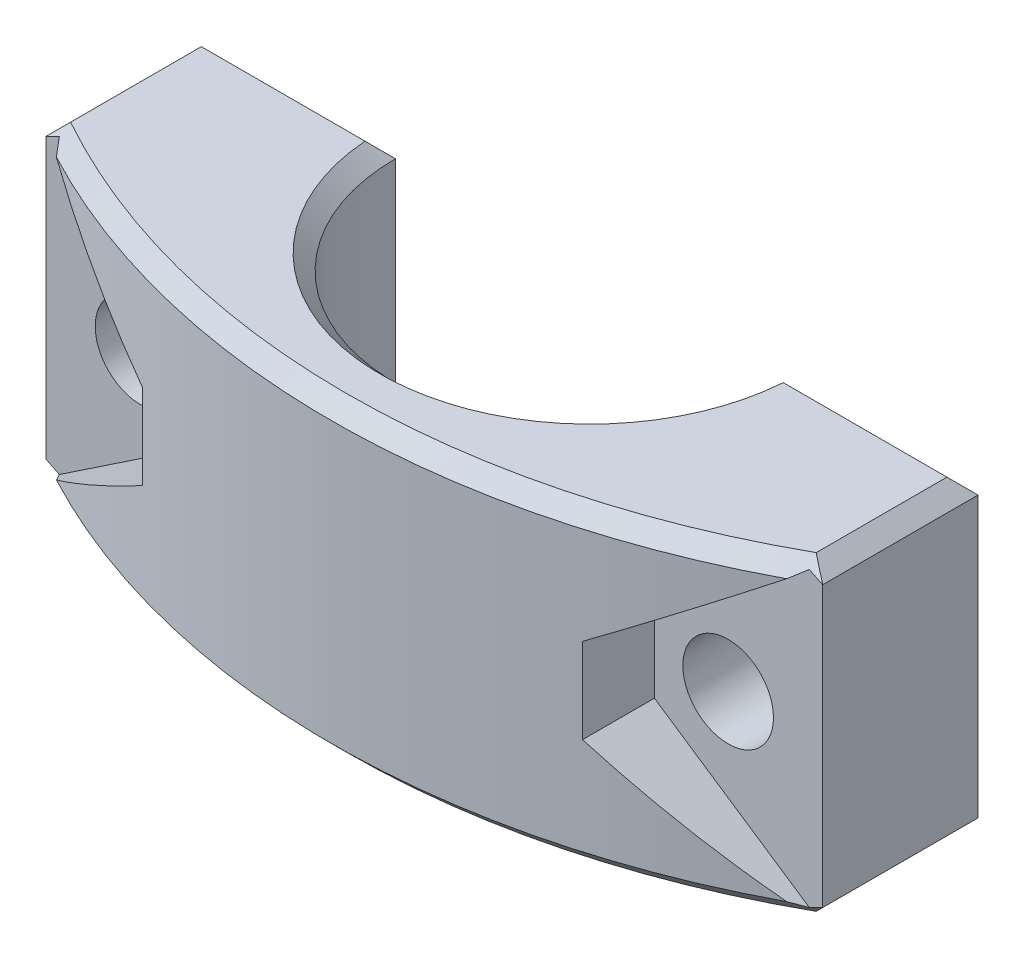
ISO-10303-21;
HEADER;
FILE_DESCRIPTION(('STEP AP214'),'2;1');
FILE_NAME('part.step','',(''),(''),'','','');
FILE_SCHEMA(('AUTOMOTIVE_DESIGN { 1 0 10303 214 1 1 1 1 }'));
ENDSEC;
DATA;
#1=APPLICATION_CONTEXT('core data for automotive mechanical design processes');
#2=APPLICATION_PROTOCOL_DEFINITION('international standard','automotive_design',2000,#1);
#3=PRODUCT_CONTEXT('',#1,'mechanical');
#4=PRODUCT('Part','Part','',(#3));
#5=PRODUCT_RELATED_PRODUCT_CATEGORY('part','',(#4));
#6=PRODUCT_DEFINITION_FORMATION('','',#4);
#7=PRODUCT_DEFINITION_CONTEXT('part definition',#1,'design');
#8=PRODUCT_DEFINITION('design','',#6,#7);
#9=PRODUCT_DEFINITION_SHAPE('','',#8);
#10=(LENGTH_UNIT() NAMED_UNIT(*) SI_UNIT(.MILLI.,.METRE.));
#11=(NAMED_UNIT(*) PLANE_ANGLE_UNIT() SI_UNIT($,.RADIAN.));
#12=(NAMED_UNIT(*) SI_UNIT($,.STERADIAN.) SOLID_ANGLE_UNIT());
#13=UNCERTAINTY_MEASURE_WITH_UNIT(LENGTH_MEASURE(1.E-05),#10,'distance_accuracy_value','');
#14=(GEOMETRIC_REPRESENTATION_CONTEXT(3) GLOBAL_UNCERTAINTY_ASSIGNED_CONTEXT((#13)) GLOBAL_UNIT_ASSIGNED_CONTEXT((#10,
#11,#12)) REPRESENTATION_CONTEXT('',''));
#15=CARTESIAN_POINT('',(0.,0.,0.));
#16=DIRECTION('',(0.,0.,1.));
#17=DIRECTION('',(1.,0.,0.));
#18=AXIS2_PLACEMENT_3D('',#15,#16,#17);
#19=CARTESIAN_POINT('',(-15.,6.,5.));
#20=DIRECTION('',(0.,-1.,0.));
#21=DIRECTION('',(0.,0.,-1.));
#22=AXIS2_PLACEMENT_3D('',#19,#20,#21);
#23=PLANE('',#22);
#24=DIRECTION('',(-1.,0.,0.));
#25=VECTOR('',#24,1.);
#26=CARTESIAN_POINT('',(-15.,6.,-4.4));
#27=LINE('',#26,#25);
#28=CARTESIAN_POINT('',(-8.07774721070175,6.,-4.4));
#29=VERTEX_POINT('',#28);
#30=CARTESIAN_POINT('',(-14.4,6.,-4.4));
#31=VERTEX_POINT('',#30);
#32=EDGE_CURVE('E254',#29,#31,#27,.T.);
#33=ORIENTED_EDGE('',*,*,#32,.T.);
#34=DIRECTION('',(0.,0.,1.));
#35=VECTOR('',#34,1.);
#36=CARTESIAN_POINT('',(-14.4,6.,5.));
#37=LINE('',#36,#35);
#38=CARTESIAN_POINT('',(-14.4,6.,0.650290977988969));
#39=VERTEX_POINT('',#38);
#40=EDGE_CURVE('E256',#31,#39,#37,.T.);
#41=ORIENTED_EDGE('',*,*,#40,.T.);
#42=CARTESIAN_POINT('',(0.,6.,-25.125));
#43=DIRECTION('',(0.,-1.,0.));
#44=DIRECTION('',(0.,0.,-1.));
#45=AXIS2_PLACEMENT_3D('',#42,#43,#44);
#46=CIRCLE('',#45,29.525);
#47=CARTESIAN_POINT('',(14.4,6.,0.650290977988972));
#48=VERTEX_POINT('',#47);
#49=EDGE_CURVE('E246',#39,#48,#46,.F.);
#50=ORIENTED_EDGE('',*,*,#49,.T.);
#51=DIRECTION('',(0.,0.,-1.));
#52=VECTOR('',#51,1.);
#53=CARTESIAN_POINT('',(14.4,6.,5.));
#54=LINE('',#53,#52);
#55=CARTESIAN_POINT('',(14.4,6.,-4.4));
#56=VERTEX_POINT('',#55);
#57=EDGE_CURVE('E248',#48,#56,#54,.T.);
#58=ORIENTED_EDGE('',*,*,#57,.T.);
#59=DIRECTION('',(-1.,0.,0.));
#60=VECTOR('',#59,1.);
#61=CARTESIAN_POINT('',(-15.,6.,-4.4));
#62=LINE('',#61,#60);
#63=CARTESIAN_POINT('',(8.07774721070176,6.,-4.4));
#64=VERTEX_POINT('',#63);
#65=EDGE_CURVE('E250',#56,#64,#62,.T.);
#66=ORIENTED_EDGE('',*,*,#65,.T.);
#67=CARTESIAN_POINT('',(0.,6.,-5.));
#68=DIRECTION('',(0.,-1.,0.));
#69=DIRECTION('',(0.,0.,-1.));
#70=AXIS2_PLACEMENT_3D('',#67,#68,#69);
#71=CIRCLE('',#70,8.1);
#72=EDGE_CURVE('E252',#64,#29,#71,.T.);
#73=ORIENTED_EDGE('',*,*,#72,.T.);
#74=EDGE_LOOP('',(#33,#41,#50,#58,#66,#73));
#75=FACE_BOUND('',#74,.T.);
#76=ADVANCED_FACE('F32',(#75),#23,.F.);
#77=CARTESIAN_POINT('',(-15.,-6.,5.));
#78=DIRECTION('',(0.,1.,0.));
#79=DIRECTION('',(0.,0.,1.));
#80=AXIS2_PLACEMENT_3D('',#77,#78,#79);
#81=PLANE('',#80);
#82=CARTESIAN_POINT('',(0.,-6.,-5.));
#83=DIRECTION('',(0.,1.,0.));
#84=DIRECTION('',(0.,0.,1.));
#85=AXIS2_PLACEMENT_3D('',#82,#83,#84);
#86=CIRCLE('',#85,8.1);
#87=CARTESIAN_POINT('',(-8.07774721070176,-6.,-4.39999999999999));
#88=VERTEX_POINT('',#87);
#89=CARTESIAN_POINT('',(8.07774721070176,-6.,-4.39999999999999));
#90=VERTEX_POINT('',#89);
#91=EDGE_CURVE('E50',#88,#90,#86,.T.);
#92=ORIENTED_EDGE('',*,*,#91,.T.);
#93=DIRECTION('',(1.,0.,0.));
#94=VECTOR('',#93,1.);
#95=CARTESIAN_POINT('',(-15.,-6.,-4.39999999999999));
#96=LINE('',#95,#94);
#97=CARTESIAN_POINT('',(14.4,-6.,-4.39999999999999));
#98=VERTEX_POINT('',#97);
#99=EDGE_CURVE('E503',#90,#98,#96,.T.);
#100=ORIENTED_EDGE('',*,*,#99,.T.);
#101=DIRECTION('',(0.,0.,1.));
#102=VECTOR('',#101,1.);
#103=CARTESIAN_POINT('',(14.4,-6.,5.));
#104=LINE('',#103,#102);
#105=CARTESIAN_POINT('',(14.4,-6.,0.650290977988969));
#106=VERTEX_POINT('',#105);
#107=EDGE_CURVE('E499',#98,#106,#104,.T.);
#108=ORIENTED_EDGE('',*,*,#107,.T.);
#109=CARTESIAN_POINT('',(0.,-6.,-25.125));
#110=DIRECTION('',(0.,1.,0.));
#111=DIRECTION('',(0.,0.,1.));
#112=AXIS2_PLACEMENT_3D('',#109,#110,#111);
#113=CIRCLE('',#112,29.525);
#114=CARTESIAN_POINT('',(-14.4,-6.,0.650290977988969));
#115=VERTEX_POINT('',#114);
#116=EDGE_CURVE('E495',#106,#115,#113,.F.);
#117=ORIENTED_EDGE('',*,*,#116,.T.);
#118=DIRECTION('',(0.,0.,-1.));
#119=VECTOR('',#118,1.);
#120=CARTESIAN_POINT('',(-14.4,-6.,5.));
#121=LINE('',#120,#119);
#122=CARTESIAN_POINT('',(-14.4,-6.,-4.39999999999999));
#123=VERTEX_POINT('',#122);
#124=EDGE_CURVE('E699',#115,#123,#121,.T.);
#125=ORIENTED_EDGE('',*,*,#124,.T.);
#126=DIRECTION('',(1.,0.,0.));
#127=VECTOR('',#126,1.);
#128=CARTESIAN_POINT('',(-15.,-6.,-4.39999999999999));
#129=LINE('',#128,#127);
#130=EDGE_CURVE('E55',#123,#88,#129,.T.);
#131=ORIENTED_EDGE('',*,*,#130,.T.);
#132=EDGE_LOOP('',(#92,#100,#108,#117,#125,#131));
#133=FACE_BOUND('',#132,.T.);
#134=ADVANCED_FACE('F430',(#133),#81,.F.);
#135=CARTESIAN_POINT('',(-1.87224838545239,2.79468823708029,1.));
#136=DIRECTION('',(0.556576340680105,-0.830796471462863,0.));
#137=DIRECTION('',(0.830796471462863,0.556576340680105,0.));
#138=AXIS2_PLACEMENT_3D('',#135,#136,#137);
#139=PLANE('',#138);
#140=DIRECTION('',(0.830796471462863,0.556576340680105,0.));
#141=VECTOR('',#140,1.);
#142=CARTESIAN_POINT('',(-1.87224838545239,2.79468823708029,1.));
#143=LINE('',#142,#141);
#144=CARTESIAN_POINT('',(-14.4833608718078,-5.65388741370665,1.));
#145=VERTEX_POINT('',#144);
#146=CARTESIAN_POINT('',(-8.5,-1.64544826719043,1.));
#147=VERTEX_POINT('',#146);
#148=EDGE_CURVE('E197',#145,#147,#143,.T.);
#149=ORIENTED_EDGE('',*,*,#148,.F.);
#150=CARTESIAN_POINT('',(48.0990437732195,36.2720077540461,-25.125));
#151=DIRECTION('',(0.556576340680105,-0.830796471462863,0.));
#152=DIRECTION('',(0.830796471462863,0.556576340680105,0.));
#153=AXIS2_PLACEMENT_3D('',#150,#151,#152);
#154=ELLIPSE('',#153,86.419490477164,53.303773886438);
#155=CARTESIAN_POINT('',(-14.1043854248842,-5.4,1.49420240702779));
#156=VERTEX_POINT('',#155);
#157=EDGE_CURVE('E11',#145,#156,#154,.F.);
#158=ORIENTED_EDGE('',*,*,#157,.T.);
#159=CARTESIAN_POINT('',(0.,4.04896553725285,-25.125));
#160=DIRECTION('',(0.556576340680105,-0.830796471462863,0.));
#161=DIRECTION('',(0.830796471462863,0.556576340680105,0.));
#162=AXIS2_PLACEMENT_3D('',#159,#160,#161);
#163=ELLIPSE('',#162,36.260385106061,30.125);
#164=CARTESIAN_POINT('',(-8.5,-1.64544826719043,3.77596235421927));
#165=VERTEX_POINT('',#164);
#166=EDGE_CURVE('E469',#165,#156,#163,.T.);
#167=ORIENTED_EDGE('',*,*,#166,.F.);
#168=DIRECTION('',(0.,0.,1.));
#169=VECTOR('',#168,1.);
#170=CARTESIAN_POINT('',(-8.5,-1.64544826719043,1.));
#171=LINE('',#170,#169);
#172=EDGE_CURVE('E217',#147,#165,#171,.T.);
#173=ORIENTED_EDGE('',*,*,#172,.F.);
#174=EDGE_LOOP('',(#149,#158,#167,#173));
#175=FACE_BOUND('',#174,.T.);
#176=ADVANCED_FACE('F435',(#175),#139,.F.);
#177=CARTESIAN_POINT('',(-1.87224838545239,-2.79468823708029,1.));
#178=DIRECTION('',(0.556576340680105,0.830796471462863,0.));
#179=DIRECTION('',(-0.830796471462863,0.556576340680105,0.));
#180=AXIS2_PLACEMENT_3D('',#177,#178,#179);
#181=PLANE('',#180);
#182=CARTESIAN_POINT('',(0.,-4.04896553725285,-25.125));
#183=DIRECTION('',(0.556576340680105,0.830796471462863,0.));
#184=DIRECTION('',(-0.830796471462863,0.556576340680105,0.));
#185=AXIS2_PLACEMENT_3D('',#182,#183,#184);
#186=ELLIPSE('',#185,36.260385106061,30.125);
#187=CARTESIAN_POINT('',(-14.1043854248842,5.4,1.49420240702778));
#188=VERTEX_POINT('',#187);
#189=CARTESIAN_POINT('',(-8.5,1.64544826719043,3.77596235421927));
#190=VERTEX_POINT('',#189);
#191=EDGE_CURVE('E183',#188,#190,#186,.T.);
#192=ORIENTED_EDGE('',*,*,#191,.F.);
#193=CARTESIAN_POINT('',(48.0990437732202,-36.2720077540466,-25.125));
#194=DIRECTION('',(0.556576340680105,0.830796471462863,0.));
#195=DIRECTION('',(0.830796471462863,-0.556576340680105,0.));
#196=AXIS2_PLACEMENT_3D('',#193,#194,#195);
#197=ELLIPSE('',#196,86.4194904771649,53.3037738864383);
#198=CARTESIAN_POINT('',(-14.4833608718078,5.65388741370666,1.));
#199=VERTEX_POINT('',#198);
#200=EDGE_CURVE('E279',#188,#199,#197,.F.);
#201=ORIENTED_EDGE('',*,*,#200,.T.);
#202=DIRECTION('',(-0.830796471462863,0.556576340680105,0.));
#203=VECTOR('',#202,1.);
#204=CARTESIAN_POINT('',(-1.87224838545239,-2.79468823708029,1.));
#205=LINE('',#204,#203);
#206=CARTESIAN_POINT('',(-8.5,1.64544826719043,1.));
#207=VERTEX_POINT('',#206);
#208=EDGE_CURVE('E208',#207,#199,#205,.T.);
#209=ORIENTED_EDGE('',*,*,#208,.F.);
#210=DIRECTION('',(0.,0.,1.));
#211=VECTOR('',#210,1.);
#212=CARTESIAN_POINT('',(-8.5,1.64544826719043,1.));
#213=LINE('',#212,#211);
#214=EDGE_CURVE('E218',#207,#190,#213,.T.);
#215=ORIENTED_EDGE('',*,*,#214,.T.);
#216=EDGE_LOOP('',(#192,#201,#209,#215));
#217=FACE_BOUND('',#216,.T.);
#218=ADVANCED_FACE('F426',(#217),#181,.F.);
#219=CARTESIAN_POINT('',(-8.5,0.,1.));
#220=DIRECTION('',(1.,0.,0.));
#221=DIRECTION('',(0.,0.,-1.));
#222=AXIS2_PLACEMENT_3D('',#219,#220,#221);
#223=PLANE('',#222);
#224=DIRECTION('',(0.,1.,0.));
#225=VECTOR('',#224,1.);
#226=CARTESIAN_POINT('',(-8.5,-48.2788363132194,3.77596235421928));
#227=LINE('',#226,#225);
#228=EDGE_CURVE('E719',#190,#165,#227,.F.);
#229=ORIENTED_EDGE('',*,*,#228,.F.);
#230=ORIENTED_EDGE('',*,*,#214,.F.);
#231=DIRECTION('',(0.,1.,0.));
#232=VECTOR('',#231,1.);
#233=CARTESIAN_POINT('',(-8.5,0.,1.));
#234=LINE('',#233,#232);
#235=EDGE_CURVE('E199',#147,#207,#234,.T.);
#236=ORIENTED_EDGE('',*,*,#235,.F.);
#237=ORIENTED_EDGE('',*,*,#172,.T.);
#238=EDGE_LOOP('',(#229,#230,#236,#237));
#239=FACE_BOUND('',#238,.T.);
#240=ADVANCED_FACE('F422',(#239),#223,.F.);
#241=CARTESIAN_POINT('',(1.87224838545239,2.79468823708029,1.));
#242=DIRECTION('',(0.556576340680105,0.830796471462863,0.));
#243=DIRECTION('',(-0.830796471462863,0.556576340680105,0.));
#244=AXIS2_PLACEMENT_3D('',#241,#242,#243);
#245=PLANE('',#244);
#246=CARTESIAN_POINT('',(0.,4.04896553725285,-25.125));
#247=DIRECTION('',(0.556576340680105,0.830796471462863,0.));
#248=DIRECTION('',(-0.830796471462863,0.556576340680105,0.));
#249=AXIS2_PLACEMENT_3D('',#246,#247,#248);
#250=ELLIPSE('',#249,36.260385106061,30.125);
#251=CARTESIAN_POINT('',(8.5,-1.64544826719043,3.77596235421928));
#252=VERTEX_POINT('',#251);
#253=CARTESIAN_POINT('',(14.1043854248842,-5.40000000000001,1.49420240702778));
#254=VERTEX_POINT('',#253);
#255=EDGE_CURVE('E171',#252,#254,#250,.T.);
#256=ORIENTED_EDGE('',*,*,#255,.T.);
#257=CARTESIAN_POINT('',(-48.0990437732194,36.2720077540461,-25.125));
#258=DIRECTION('',(0.556576340680105,0.830796471462863,0.));
#259=DIRECTION('',(-0.830796471462863,0.556576340680105,0.));
#260=AXIS2_PLACEMENT_3D('',#257,#258,#259);
#261=ELLIPSE('',#260,86.419490477164,53.303773886438);
#262=CARTESIAN_POINT('',(14.4833608718078,-5.65388741370666,1.));
#263=VERTEX_POINT('',#262);
#264=EDGE_CURVE('E42',#254,#263,#261,.T.);
#265=ORIENTED_EDGE('',*,*,#264,.T.);
#266=DIRECTION('',(-0.830796471462863,0.556576340680105,0.));
#267=VECTOR('',#266,1.);
#268=CARTESIAN_POINT('',(1.87224838545239,2.79468823708029,1.));
#269=LINE('',#268,#267);
#270=CARTESIAN_POINT('',(8.5,-1.64544826719043,1.));
#271=VERTEX_POINT('',#270);
#272=EDGE_CURVE('E195',#263,#271,#269,.T.);
#273=ORIENTED_EDGE('',*,*,#272,.T.);
#274=DIRECTION('',(0.,0.,1.));
#275=VECTOR('',#274,1.);
#276=CARTESIAN_POINT('',(8.5,-1.64544826719043,1.));
#277=LINE('',#276,#275);
#278=EDGE_CURVE('E188',#271,#252,#277,.T.);
#279=ORIENTED_EDGE('',*,*,#278,.T.);
#280=EDGE_LOOP('',(#256,#265,#273,#279));
#281=FACE_BOUND('',#280,.T.);
#282=ADVANCED_FACE('F193',(#281),#245,.T.);
#283=CARTESIAN_POINT('',(8.5,0.,1.));
#284=DIRECTION('',(1.,0.,0.));
#285=DIRECTION('',(0.,0.,-1.));
#286=AXIS2_PLACEMENT_3D('',#283,#284,#285);
#287=PLANE('',#286);
#288=DIRECTION('',(0.,0.,1.));
#289=VECTOR('',#288,1.);
#290=CARTESIAN_POINT('',(8.5,1.64544826719043,1.));
#291=LINE('',#290,#289);
#292=CARTESIAN_POINT('',(8.5,1.64544826719043,1.));
#293=VERTEX_POINT('',#292);
#294=CARTESIAN_POINT('',(8.5,1.64544826719043,3.77596235421927));
#295=VERTEX_POINT('',#294);
#296=EDGE_CURVE('E190',#293,#295,#291,.T.);
#297=ORIENTED_EDGE('',*,*,#296,.T.);
#298=DIRECTION('',(0.,1.,0.));
#299=VECTOR('',#298,1.);
#300=CARTESIAN_POINT('',(8.5,-48.2788363132194,3.77596235421928));
#301=LINE('',#300,#299);
#302=EDGE_CURVE('E175',#295,#252,#301,.F.);
#303=ORIENTED_EDGE('',*,*,#302,.T.);
#304=ORIENTED_EDGE('',*,*,#278,.F.);
#305=DIRECTION('',(0.,1.,0.));
#306=VECTOR('',#305,1.);
#307=CARTESIAN_POINT('',(8.5,0.,1.));
#308=LINE('',#307,#306);
#309=EDGE_CURVE('E722',#271,#293,#308,.T.);
#310=ORIENTED_EDGE('',*,*,#309,.T.);
#311=EDGE_LOOP('',(#297,#303,#304,#310));
#312=FACE_BOUND('',#311,.T.);
#313=ADVANCED_FACE('F187',(#312),#287,.T.);
#314=CARTESIAN_POINT('',(1.87224838545239,-2.79468823708029,1.));
#315=DIRECTION('',(0.556576340680105,-0.830796471462863,0.));
#316=DIRECTION('',(0.830796471462863,0.556576340680105,0.));
#317=AXIS2_PLACEMENT_3D('',#314,#315,#316);
#318=PLANE('',#317);
#319=DIRECTION('',(0.830796471462863,0.556576340680105,0.));
#320=VECTOR('',#319,1.);
#321=CARTESIAN_POINT('',(1.87224838545239,-2.79468823708029,1.));
#322=LINE('',#321,#320);
#323=CARTESIAN_POINT('',(14.4833608718078,5.65388741370666,1.));
#324=VERTEX_POINT('',#323);
#325=EDGE_CURVE('E491',#293,#324,#322,.T.);
#326=ORIENTED_EDGE('',*,*,#325,.T.);
#327=CARTESIAN_POINT('',(-48.0990437732202,-36.2720077540466,-25.125));
#328=DIRECTION('',(0.556576340680105,-0.830796471462863,0.));
#329=DIRECTION('',(-0.830796471462863,-0.556576340680105,0.));
#330=AXIS2_PLACEMENT_3D('',#327,#328,#329);
#331=ELLIPSE('',#330,86.4194904771649,53.3037738864383);
#332=CARTESIAN_POINT('',(14.1043854248842,5.4,1.49420240702779));
#333=VERTEX_POINT('',#332);
#334=EDGE_CURVE('E403',#324,#333,#331,.T.);
#335=ORIENTED_EDGE('',*,*,#334,.T.);
#336=CARTESIAN_POINT('',(0.,-4.04896553725285,-25.125));
#337=DIRECTION('',(0.556576340680105,-0.830796471462863,0.));
#338=DIRECTION('',(0.830796471462863,0.556576340680105,0.));
#339=AXIS2_PLACEMENT_3D('',#336,#337,#338);
#340=ELLIPSE('',#339,36.260385106061,30.125);
#341=EDGE_CURVE('E191',#333,#295,#340,.T.);
#342=ORIENTED_EDGE('',*,*,#341,.T.);
#343=ORIENTED_EDGE('',*,*,#296,.F.);
#344=EDGE_LOOP('',(#326,#335,#342,#343));
#345=FACE_BOUND('',#344,.T.);
#346=ADVANCED_FACE('F418',(#345),#318,.T.);
#347=CARTESIAN_POINT('',(15.,6.,5.));
#348=DIRECTION('',(-1.,0.,0.));
#349=DIRECTION('',(0.,-1.,0.));
#350=AXIS2_PLACEMENT_3D('',#347,#348,#349);
#351=PLANE('',#350);
#352=DIRECTION('',(0.,1.,0.));
#353=VECTOR('',#352,1.);
#354=CARTESIAN_POINT('',(15.,6.,-5.));
#355=LINE('',#354,#353);
#356=CARTESIAN_POINT('',(15.,-5.4,-5.));
#357=VERTEX_POINT('',#356);
#358=CARTESIAN_POINT('',(15.,5.4,-5.));
#359=VERTEX_POINT('',#358);
#360=EDGE_CURVE('E229',#357,#359,#355,.T.);
#361=ORIENTED_EDGE('',*,*,#360,.T.);
#362=DIRECTION('',(0.,0.,1.));
#363=VECTOR('',#362,1.);
#364=CARTESIAN_POINT('',(15.,5.4,5.));
#365=LINE('',#364,#363);
#366=CARTESIAN_POINT('',(15.,5.4,1.));
#367=VERTEX_POINT('',#366);
#368=EDGE_CURVE('E274',#359,#367,#365,.T.);
#369=ORIENTED_EDGE('',*,*,#368,.T.);
#370=DIRECTION('',(0.,-1.,0.));
#371=VECTOR('',#370,1.);
#372=CARTESIAN_POINT('',(15.,0.,1.));
#373=LINE('',#372,#371);
#374=CARTESIAN_POINT('',(15.,-5.4,1.));
#375=VERTEX_POINT('',#374);
#376=EDGE_CURVE('E484',#367,#375,#373,.T.);
#377=ORIENTED_EDGE('',*,*,#376,.T.);
#378=DIRECTION('',(0.,0.,-1.));
#379=VECTOR('',#378,1.);
#380=CARTESIAN_POINT('',(15.,-5.4,5.));
#381=LINE('',#380,#379);
#382=EDGE_CURVE('E272',#375,#357,#381,.T.);
#383=ORIENTED_EDGE('',*,*,#382,.T.);
#384=EDGE_LOOP('',(#361,#369,#377,#383));
#385=FACE_BOUND('',#384,.T.);
#386=ADVANCED_FACE('F391',(#385),#351,.F.);
#387=CARTESIAN_POINT('',(11.35,0.,-5.));
#388=DIRECTION('',(0.,0.,1.));
#389=DIRECTION('',(1.,0.,0.));
#390=AXIS2_PLACEMENT_3D('',#387,#388,#389);
#391=CYLINDRICAL_SURFACE('',#390,1.75);
#392=CARTESIAN_POINT('',(11.35,0.,-5.));
#393=DIRECTION('',(0.,0.,1.));
#394=DIRECTION('',(1.,0.,0.));
#395=AXIS2_PLACEMENT_3D('',#392,#393,#394);
#396=CIRCLE('',#395,1.75);
#397=CARTESIAN_POINT('',(13.1,0.,-5.));
#398=VERTEX_POINT('',#397);
#399=EDGE_CURVE('E226',#398,#398,#396,.T.);
#400=ORIENTED_EDGE('',*,*,#399,.F.);
#401=EDGE_LOOP('',(#400));
#402=FACE_BOUND('',#401,.T.);
#403=CARTESIAN_POINT('',(11.35,0.,1.));
#404=DIRECTION('',(0.,0.,-1.));
#405=DIRECTION('',(-1.,0.,0.));
#406=AXIS2_PLACEMENT_3D('',#403,#404,#405);
#407=CIRCLE('',#406,1.75);
#408=CARTESIAN_POINT('',(9.6,0.,1.));
#409=VERTEX_POINT('',#408);
#410=EDGE_CURVE('E201',#409,#409,#407,.F.);
#411=ORIENTED_EDGE('',*,*,#410,.T.);
#412=EDGE_LOOP('',(#411));
#413=FACE_BOUND('',#412,.T.);
#414=ADVANCED_FACE('F441',(#402,#413),#391,.F.);
#415=CARTESIAN_POINT('',(-15.,6.,5.));
#416=DIRECTION('',(1.,0.,0.));
#417=DIRECTION('',(0.,1.,0.));
#418=AXIS2_PLACEMENT_3D('',#415,#416,#417);
#419=PLANE('',#418);
#420=DIRECTION('',(0.,-1.,0.));
#421=VECTOR('',#420,1.);
#422=CARTESIAN_POINT('',(-15.,0.,1.));
#423=LINE('',#422,#421);
#424=CARTESIAN_POINT('',(-15.,5.4,1.));
#425=VERTEX_POINT('',#424);
#426=CARTESIAN_POINT('',(-15.,-5.39999999999999,1.));
#427=VERTEX_POINT('',#426);
#428=EDGE_CURVE('E211',#425,#427,#423,.T.);
#429=ORIENTED_EDGE('',*,*,#428,.F.);
#430=DIRECTION('',(0.,0.,-1.));
#431=VECTOR('',#430,1.);
#432=CARTESIAN_POINT('',(-15.,5.4,5.));
#433=LINE('',#432,#431);
#434=CARTESIAN_POINT('',(-15.,5.4,-5.));
#435=VERTEX_POINT('',#434);
#436=EDGE_CURVE('E243',#425,#435,#433,.T.);
#437=ORIENTED_EDGE('',*,*,#436,.T.);
#438=DIRECTION('',(0.,-1.,0.));
#439=VECTOR('',#438,1.);
#440=CARTESIAN_POINT('',(-15.,6.,-5.));
#441=LINE('',#440,#439);
#442=CARTESIAN_POINT('',(-15.,-5.4,-5.));
#443=VERTEX_POINT('',#442);
#444=EDGE_CURVE('E232',#435,#443,#441,.T.);
#445=ORIENTED_EDGE('',*,*,#444,.T.);
#446=DIRECTION('',(0.,0.,1.));
#447=VECTOR('',#446,1.);
#448=CARTESIAN_POINT('',(-15.,-5.4,5.));
#449=LINE('',#448,#447);
#450=EDGE_CURVE('E241',#443,#427,#449,.T.);
#451=ORIENTED_EDGE('',*,*,#450,.T.);
#452=EDGE_LOOP('',(#429,#437,#445,#451));
#453=FACE_BOUND('',#452,.T.);
#454=ADVANCED_FACE('F438',(#453),#419,.F.);
#455=CARTESIAN_POINT('',(-11.35,0.,-5.));
#456=DIRECTION('',(0.,0.,1.));
#457=DIRECTION('',(1.,0.,0.));
#458=AXIS2_PLACEMENT_3D('',#455,#456,#457);
#459=CYLINDRICAL_SURFACE('',#458,1.75);
#460=CARTESIAN_POINT('',(-11.35,0.,-5.));
#461=DIRECTION('',(0.,0.,-1.));
#462=DIRECTION('',(-1.,0.,0.));
#463=AXIS2_PLACEMENT_3D('',#460,#461,#462);
#464=CIRCLE('',#463,1.75);
#465=CARTESIAN_POINT('',(-13.1,0.,-5.));
#466=VERTEX_POINT('',#465);
#467=EDGE_CURVE('E221',#466,#466,#464,.T.);
#468=ORIENTED_EDGE('',*,*,#467,.T.);
#469=EDGE_LOOP('',(#468));
#470=FACE_BOUND('',#469,.T.);
#471=CARTESIAN_POINT('',(-11.35,0.,1.));
#472=DIRECTION('',(0.,0.,1.));
#473=DIRECTION('',(1.,0.,0.));
#474=AXIS2_PLACEMENT_3D('',#471,#472,#473);
#475=CIRCLE('',#474,1.75);
#476=CARTESIAN_POINT('',(-9.6,0.,1.));
#477=VERTEX_POINT('',#476);
#478=EDGE_CURVE('E214',#477,#477,#475,.F.);
#479=ORIENTED_EDGE('',*,*,#478,.F.);
#480=EDGE_LOOP('',(#479));
#481=FACE_BOUND('',#480,.T.);
#482=ADVANCED_FACE('F440',(#470,#481),#459,.F.);
#483=CARTESIAN_POINT('',(0.,0.,-5.));
#484=DIRECTION('',(0.,0.,1.));
#485=DIRECTION('',(1.,0.,0.));
#486=AXIS2_PLACEMENT_3D('',#483,#484,#485);
#487=PLANE('',#486);
#488=ORIENTED_EDGE('',*,*,#467,.F.);
#489=EDGE_LOOP('',(#488));
#490=FACE_BOUND('',#489,.T.);
#491=ORIENTED_EDGE('',*,*,#444,.F.);
#492=DIRECTION('',(1.,0.,0.));
#493=VECTOR('',#492,1.);
#494=CARTESIAN_POINT('',(0.,5.4,-5.));
#495=LINE('',#494,#493);
#496=CARTESIAN_POINT('',(-7.49999999999999,5.4,-5.));
#497=VERTEX_POINT('',#496);
#498=EDGE_CURVE('E261',#435,#497,#495,.T.);
#499=ORIENTED_EDGE('',*,*,#498,.T.);
#500=DIRECTION('',(0.,-1.,0.));
#501=VECTOR('',#500,1.);
#502=CARTESIAN_POINT('',(-7.49999999999999,48.2788363132194,-5.));
#503=LINE('',#502,#501);
#504=CARTESIAN_POINT('',(-7.49999999999999,-5.4,-5.));
#505=VERTEX_POINT('',#504);
#506=EDGE_CURVE('E238',#505,#497,#503,.F.);
#507=ORIENTED_EDGE('',*,*,#506,.F.);
#508=DIRECTION('',(-1.,0.,0.));
#509=VECTOR('',#508,1.);
#510=CARTESIAN_POINT('',(0.,-5.4,-5.));
#511=LINE('',#510,#509);
#512=EDGE_CURVE('E259',#505,#443,#511,.T.);
#513=ORIENTED_EDGE('',*,*,#512,.T.);
#514=EDGE_LOOP('',(#491,#499,#507,#513));
#515=FACE_BOUND('',#514,.T.);
#516=ADVANCED_FACE('F444',(#490,#515),#487,.F.);
#517=ORIENTED_EDGE('',*,*,#399,.T.);
#518=EDGE_LOOP('',(#517));
#519=FACE_BOUND('',#518,.T.);
#520=DIRECTION('',(0.,-1.,0.));
#521=VECTOR('',#520,1.);
#522=CARTESIAN_POINT('',(7.49999999999999,48.2788363132194,-5.));
#523=LINE('',#522,#521);
#524=CARTESIAN_POINT('',(7.49999999999999,5.4,-5.));
#525=VERTEX_POINT('',#524);
#526=CARTESIAN_POINT('',(7.49999999999999,-5.4,-5.));
#527=VERTEX_POINT('',#526);
#528=EDGE_CURVE('E235',#525,#527,#523,.T.);
#529=ORIENTED_EDGE('',*,*,#528,.F.);
#530=DIRECTION('',(1.,0.,0.));
#531=VECTOR('',#530,1.);
#532=CARTESIAN_POINT('',(0.,5.4,-5.));
#533=LINE('',#532,#531);
#534=EDGE_CURVE('E270',#525,#359,#533,.T.);
#535=ORIENTED_EDGE('',*,*,#534,.T.);
#536=ORIENTED_EDGE('',*,*,#360,.F.);
#537=DIRECTION('',(-1.,0.,0.));
#538=VECTOR('',#537,1.);
#539=CARTESIAN_POINT('',(0.,-5.4,-5.));
#540=LINE('',#539,#538);
#541=EDGE_CURVE('E267',#357,#527,#540,.T.);
#542=ORIENTED_EDGE('',*,*,#541,.T.);
#543=EDGE_LOOP('',(#529,#535,#536,#542));
#544=FACE_BOUND('',#543,.T.);
#545=ADVANCED_FACE('F447',(#519,#544),#487,.F.);
#546=CARTESIAN_POINT('',(0.,48.2788363132194,-5.));
#547=DIRECTION('',(0.,-1.,0.));
#548=DIRECTION('',(0.,0.,-1.));
#549=AXIS2_PLACEMENT_3D('',#546,#547,#548);
#550=CYLINDRICAL_SURFACE('',#549,7.49999999999999);
#551=ORIENTED_EDGE('',*,*,#506,.T.);
#552=CARTESIAN_POINT('',(0.,5.4,-5.));
#553=DIRECTION('',(0.,-1.,0.));
#554=DIRECTION('',(0.,0.,-1.));
#555=AXIS2_PLACEMENT_3D('',#552,#553,#554);
#556=CIRCLE('',#555,7.49999999999999);
#557=EDGE_CURVE('E265',#497,#525,#556,.F.);
#558=ORIENTED_EDGE('',*,*,#557,.T.);
#559=ORIENTED_EDGE('',*,*,#528,.T.);
#560=CARTESIAN_POINT('',(0.,-5.4,-5.));
#561=DIRECTION('',(0.,1.,0.));
#562=DIRECTION('',(0.,0.,1.));
#563=AXIS2_PLACEMENT_3D('',#560,#561,#562);
#564=CIRCLE('',#563,7.49999999999999);
#565=EDGE_CURVE('E263',#527,#505,#564,.F.);
#566=ORIENTED_EDGE('',*,*,#565,.T.);
#567=EDGE_LOOP('',(#551,#558,#559,#566));
#568=FACE_BOUND('',#567,.T.);
#569=ADVANCED_FACE('F449',(#568),#550,.F.);
#570=CARTESIAN_POINT('',(0.,0.,1.));
#571=DIRECTION('',(0.,0.,1.));
#572=DIRECTION('',(1.,0.,0.));
#573=AXIS2_PLACEMENT_3D('',#570,#571,#572);
#574=PLANE('',#573);
#575=ORIENTED_EDGE('',*,*,#208,.T.);
#576=CARTESIAN_POINT('',(-14.4833608718078,5.65388741370666,1.));
#577=CARTESIAN_POINT('',(-14.5696900194588,5.6120258637969,1.));
#578=CARTESIAN_POINT('',(-14.6559078552245,5.56993780374026,1.));
#579=CARTESIAN_POINT('',(-14.8281208979422,5.48530866581151,1.));
#580=CARTESIAN_POINT('',(-14.9141161049072,5.44276758796593,1.));
#581=CARTESIAN_POINT('',(-15.,5.4,1.));
#582=B_SPLINE_CURVE_WITH_KNOTS('',3,(#576,#577,#578,#579,#580,#581),.UNSPECIFIED.,.F.,.F.,(4,2,
4),(0.,0.28782682298749,0.575653629117538),.UNSPECIFIED.);
#583=EDGE_CURVE('E288',#199,#425,#582,.T.);
#584=ORIENTED_EDGE('',*,*,#583,.T.);
#585=ORIENTED_EDGE('',*,*,#428,.T.);
#586=CARTESIAN_POINT('',(-15.,-5.39999999999999,1.));
#587=CARTESIAN_POINT('',(-14.9141161049072,-5.44276758796592,1.));
#588=CARTESIAN_POINT('',(-14.8281208979422,-5.48530866581151,1.));
#589=CARTESIAN_POINT('',(-14.6559078552245,-5.56993780374026,1.));
#590=CARTESIAN_POINT('',(-14.5696900194588,-5.6120258637969,1.));
#591=CARTESIAN_POINT('',(-14.4833608718078,-5.65388741370666,1.));
#592=B_SPLINE_CURVE_WITH_KNOTS('',3,(#586,#587,#588,#589,#590,#591),.UNSPECIFIED.,.F.,.F.,(4,2,
4),(0.,0.287826806130049,0.575653629117541),.UNSPECIFIED.);
#593=EDGE_CURVE('E281',#427,#145,#592,.T.);
#594=ORIENTED_EDGE('',*,*,#593,.T.);
#595=ORIENTED_EDGE('',*,*,#148,.T.);
#596=ORIENTED_EDGE('',*,*,#235,.T.);
#597=EDGE_LOOP('',(#575,#584,#585,#594,#595,#596));
#598=FACE_BOUND('',#597,.T.);
#599=ORIENTED_EDGE('',*,*,#478,.T.);
#600=EDGE_LOOP('',(#599));
#601=FACE_BOUND('',#600,.T.);
#602=ADVANCED_FACE('F294',(#598,#601),#574,.T.);
#603=CARTESIAN_POINT('',(0.,0.,1.));
#604=DIRECTION('',(0.,0.,1.));
#605=DIRECTION('',(-1.,0.,0.));
#606=AXIS2_PLACEMENT_3D('',#603,#604,#605);
#607=PLANE('',#606);
#608=ORIENTED_EDGE('',*,*,#376,.F.);
#609=CARTESIAN_POINT('',(15.,5.4,1.));
#610=CARTESIAN_POINT('',(14.9141161049072,5.44276758796593,1.));
#611=CARTESIAN_POINT('',(14.8281208979422,5.48530866581151,1.));
#612=CARTESIAN_POINT('',(14.6559078552245,5.56993780374027,1.));
#613=CARTESIAN_POINT('',(14.5696900194588,5.6120258637969,1.));
#614=CARTESIAN_POINT('',(14.4833608718078,5.65388741370666,1.));
#615=B_SPLINE_CURVE_WITH_KNOTS('',3,(#609,#610,#611,#612,#613,#614),.UNSPECIFIED.,.F.,.F.,(4,2,
4),(0.,0.287826806130044,0.575653629117533),.UNSPECIFIED.);
#616=EDGE_CURVE('E397',#367,#324,#615,.T.);
#617=ORIENTED_EDGE('',*,*,#616,.T.);
#618=ORIENTED_EDGE('',*,*,#325,.F.);
#619=ORIENTED_EDGE('',*,*,#309,.F.);
#620=ORIENTED_EDGE('',*,*,#272,.F.);
#621=CARTESIAN_POINT('',(14.4833608718078,-5.65388741370666,1.));
#622=CARTESIAN_POINT('',(14.5696900194588,-5.6120258637969,1.));
#623=CARTESIAN_POINT('',(14.6559078552245,-5.56993780374026,1.));
#624=CARTESIAN_POINT('',(14.8281208979422,-5.48530866581151,1.));
#625=CARTESIAN_POINT('',(14.9141161049072,-5.44276758796593,1.));
#626=CARTESIAN_POINT('',(15.,-5.4,1.));
#627=B_SPLINE_CURVE_WITH_KNOTS('',3,(#621,#622,#623,#624,#625,#626),.UNSPECIFIED.,.F.,.F.,(4,2,
4),(0.,0.28782682298749,0.575653629117538),.UNSPECIFIED.);
#628=EDGE_CURVE('E404',#263,#375,#627,.T.);
#629=ORIENTED_EDGE('',*,*,#628,.T.);
#630=EDGE_LOOP('',(#608,#617,#618,#619,#620,#629));
#631=FACE_BOUND('',#630,.T.);
#632=ORIENTED_EDGE('',*,*,#410,.F.);
#633=EDGE_LOOP('',(#632));
#634=FACE_BOUND('',#633,.T.);
#635=ADVANCED_FACE('F409',(#631,#634),#607,.T.);
#636=CARTESIAN_POINT('',(0.,-48.2788363132194,-25.125));
#637=DIRECTION('',(0.,1.,0.));
#638=DIRECTION('',(0.,0.,1.));
#639=AXIS2_PLACEMENT_3D('',#636,#637,#638);
#640=CYLINDRICAL_SURFACE('',#639,30.125);
#641=ORIENTED_EDGE('',*,*,#341,.F.);
#642=CARTESIAN_POINT('',(0.,5.4,-25.125));
#643=DIRECTION('',(0.,-1.,0.));
#644=DIRECTION('',(0.,0.,-1.));
#645=AXIS2_PLACEMENT_3D('',#642,#643,#644);
#646=CIRCLE('',#645,30.125);
#647=EDGE_CURVE('E277',#333,#188,#646,.T.);
#648=ORIENTED_EDGE('',*,*,#647,.T.);
#649=ORIENTED_EDGE('',*,*,#191,.T.);
#650=ORIENTED_EDGE('',*,*,#228,.T.);
#651=ORIENTED_EDGE('',*,*,#166,.T.);
#652=CARTESIAN_POINT('',(0.,-5.4,-25.125));
#653=DIRECTION('',(0.,1.,0.));
#654=DIRECTION('',(0.,0.,1.));
#655=AXIS2_PLACEMENT_3D('',#652,#653,#654);
#656=CIRCLE('',#655,30.125);
#657=EDGE_CURVE('E179',#156,#254,#656,.T.);
#658=ORIENTED_EDGE('',*,*,#657,.T.);
#659=ORIENTED_EDGE('',*,*,#255,.F.);
#660=ORIENTED_EDGE('',*,*,#302,.F.);
#661=EDGE_LOOP('',(#641,#648,#649,#650,#651,#658,#659,#660));
#662=FACE_BOUND('',#661,.T.);
#663=ADVANCED_FACE('F174',(#662),#640,.T.);
#664=CARTESIAN_POINT('',(-15.,6.,-4.4));
#665=DIRECTION('',(0.,-0.70710678118655,0.707106781186546));
#666=DIRECTION('',(-1.,0.,0.));
#667=AXIS2_PLACEMENT_3D('',#664,#665,#666);
#668=PLANE('',#667);
#669=CARTESIAN_POINT('',(7.49999999999999,5.4,-5.));
#670=CARTESIAN_POINT('',(7.5493939395638,5.44939428662004,-4.95060571337996));
#671=CARTESIAN_POINT('',(7.59846287819002,5.49895083089816,-4.90104916910184));
#672=CARTESIAN_POINT('',(7.69596738287892,5.59836906942192,-4.80163093057808));
#673=CARTESIAN_POINT('',(7.74440299579848,5.6482307406873,-4.7517692593127));
#674=CARTESIAN_POINT('',(7.84066447941669,5.748246866213,-4.651753133787));
#675=CARTESIAN_POINT('',(7.88849035446617,5.79840131838045,-4.60159868161955));
#676=CARTESIAN_POINT('',(7.98355518646035,5.89899300335553,-4.50100699664447));
#677=CARTESIAN_POINT('',(8.03079409946728,5.94943025692735,-4.45056974307264));
#678=CARTESIAN_POINT('',(8.07774721070188,5.99999999999994,-4.40000000000006));
#679=B_SPLINE_CURVE_WITH_KNOTS('',3,(#669,#670,#671,#672,#673,#674,#675,#676,#677,#678),
.UNSPECIFIED.,.F.,.F.,(4,2,2,2,4),(0.,0.256658313827789,0.513297529997224,0.769934913881941,
1.02659139432377),.UNSPECIFIED.);
#680=EDGE_CURVE('E350',#64,#525,#679,.F.);
#681=ORIENTED_EDGE('',*,*,#680,.F.);
#682=ORIENTED_EDGE('',*,*,#65,.F.);
#683=DIRECTION('',(-0.577350269189627,0.577350269189624,0.577350269189627));
#684=VECTOR('',#683,1.);
#685=CARTESIAN_POINT('',(11.2666666666667,9.13333333333333,-1.26666666666665));
#686=LINE('',#685,#684);
#687=EDGE_CURVE('E347',#359,#56,#686,.T.);
#688=ORIENTED_EDGE('',*,*,#687,.F.);
#689=ORIENTED_EDGE('',*,*,#534,.F.);
#690=EDGE_LOOP('',(#681,#682,#688,#689));
#691=FACE_BOUND('',#690,.T.);
#692=ADVANCED_FACE('F334',(#691),#668,.F.);
#693=CARTESIAN_POINT('',(14.4,6.,5.));
#694=DIRECTION('',(-0.707106781186546,-0.70710678118655,0.));
#695=DIRECTION('',(0.,0.,-1.));
#696=AXIS2_PLACEMENT_3D('',#693,#694,#695);
#697=PLANE('',#696);
#698=ORIENTED_EDGE('',*,*,#687,.T.);
#699=ORIENTED_EDGE('',*,*,#57,.F.);
#700=CARTESIAN_POINT('',(16.9545141610686,3.4454858389314,2.10806222906866));
#701=CARTESIAN_POINT('',(16.5775214253713,3.82247857462869,1.8986787097826));
#702=CARTESIAN_POINT('',(16.201105540048,4.19889445995204,1.68721104321727));
#703=CARTESIAN_POINT('',(15.4495650197886,4.95043498021138,1.25985719235002));
#704=CARTESIAN_POINT('',(15.0744402847027,5.32555971529733,1.04397136020341));
#705=CARTESIAN_POINT('',(14.3255561890681,6.07444381093189,0.607495735277643));
#706=CARTESIAN_POINT('',(13.951796841411,6.44820315858904,0.38690589821887));
#707=CARTESIAN_POINT('',(13.2057475676975,7.19425243230248,-0.0593027844211832));
#708=CARTESIAN_POINT('',(12.8334577607078,7.56654223929218,-0.284922028039874));
#709=CARTESIAN_POINT('',(12.4619826729169,7.9380173270831,-0.51320199872153));
#710=B_SPLINE_CURVE_WITH_KNOTS('',3,(#700,#701,#702,#703,#704,#705,#706,#707,#708,#709),
.UNSPECIFIED.,.F.,.F.,(4,2,2,2,4),(0.,1.71836956536874,3.43660269535051,5.15485200650755,
6.87323778960347),.UNSPECIFIED.);
#711=EDGE_CURVE('E357',#367,#48,#710,.T.);
#712=ORIENTED_EDGE('',*,*,#711,.F.);
#713=ORIENTED_EDGE('',*,*,#368,.F.);
#714=EDGE_LOOP('',(#698,#699,#712,#713));
#715=FACE_BOUND('',#714,.T.);
#716=ADVANCED_FACE('F368',(#715),#697,.F.);
#717=CARTESIAN_POINT('',(0.,5.4,-5.));
#718=DIRECTION('',(0.,1.,0.));
#719=DIRECTION('',(0.,0.,1.));
#720=AXIS2_PLACEMENT_3D('',#717,#718,#719);
#721=CONICAL_SURFACE('',#720,7.49999999999999,0.785398163397454);
#722=ORIENTED_EDGE('',*,*,#680,.T.);
#723=ORIENTED_EDGE('',*,*,#557,.F.);
#724=CARTESIAN_POINT('',(-7.49999999999999,5.4,-5.));
#725=CARTESIAN_POINT('',(-7.5493939395638,5.44939428662004,-4.95060571337996));
#726=CARTESIAN_POINT('',(-7.59846287819002,5.49895083089816,-4.90104916910184));
#727=CARTESIAN_POINT('',(-7.69596738287892,5.59836906942192,-4.80163093057808));
#728=CARTESIAN_POINT('',(-7.74440299579847,5.6482307406873,-4.7517692593127));
#729=CARTESIAN_POINT('',(-7.84066447941669,5.748246866213,-4.651753133787));
#730=CARTESIAN_POINT('',(-7.88849035446616,5.79840131838045,-4.60159868161955));
#731=CARTESIAN_POINT('',(-7.98355518646034,5.89899300335553,-4.50100699664447));
#732=CARTESIAN_POINT('',(-8.03079409946728,5.94943025692735,-4.45056974307264));
#733=CARTESIAN_POINT('',(-8.07774721070188,5.99999999999994,-4.40000000000006));
#734=B_SPLINE_CURVE_WITH_KNOTS('',3,(#724,#725,#726,#727,#728,#729,#730,#731,#732,#733),
.UNSPECIFIED.,.F.,.F.,(4,2,2,2,4),(0.,0.256658313827789,0.513297529997224,0.769934913881941,
1.02659139432377),.UNSPECIFIED.);
#735=EDGE_CURVE('E375',#29,#497,#734,.F.);
#736=ORIENTED_EDGE('',*,*,#735,.F.);
#737=ORIENTED_EDGE('',*,*,#72,.F.);
#738=EDGE_LOOP('',(#722,#723,#736,#737));
#739=FACE_BOUND('',#738,.T.);
#740=ADVANCED_FACE('F362',(#739),#721,.F.);
#741=CARTESIAN_POINT('',(0.,5.4,-25.125));
#742=DIRECTION('',(0.,-1.,0.));
#743=DIRECTION('',(0.,0.,-1.));
#744=AXIS2_PLACEMENT_3D('',#741,#742,#743);
#745=CONICAL_SURFACE('',#744,30.125,0.785398163397454);
#746=ORIENTED_EDGE('',*,*,#711,.T.);
#747=ORIENTED_EDGE('',*,*,#49,.F.);
#748=CARTESIAN_POINT('',(-12.4619826729169,7.9380173270831,-0.513201998721532));
#749=CARTESIAN_POINT('',(-12.8334577607078,7.56654223929218,-0.284922028039878));
#750=CARTESIAN_POINT('',(-13.2057475676975,7.19425243230248,-0.0593027844211861));
#751=CARTESIAN_POINT('',(-13.951796841411,6.44820315858904,0.386905898218869));
#752=CARTESIAN_POINT('',(-14.3255561890681,6.07444381093189,0.607495735277644));
#753=CARTESIAN_POINT('',(-15.0744402847027,5.32555971529734,1.04397136020341));
#754=CARTESIAN_POINT('',(-15.4495650197886,4.95043498021138,1.25985719235002));
#755=CARTESIAN_POINT('',(-16.201105540048,4.19889445995204,1.68721104321726));
#756=CARTESIAN_POINT('',(-16.5775214253713,3.82247857462869,1.89867870978259));
#757=CARTESIAN_POINT('',(-16.9545141610686,3.44548583893141,2.10806222906865));
#758=B_SPLINE_CURVE_WITH_KNOTS('',3,(#748,#749,#750,#751,#752,#753,#754,#755,#756,#757),
.UNSPECIFIED.,.F.,.F.,(4,2,2,2,4),(0.,1.71838578309592,3.43663509425295,5.15486822423472,
6.87323778960346),.UNSPECIFIED.);
#759=EDGE_CURVE('E381',#425,#39,#758,.F.);
#760=ORIENTED_EDGE('',*,*,#759,.F.);
#761=ORIENTED_EDGE('',*,*,#583,.F.);
#762=ORIENTED_EDGE('',*,*,#200,.F.);
#763=ORIENTED_EDGE('',*,*,#647,.F.);
#764=ORIENTED_EDGE('',*,*,#334,.F.);
#765=ORIENTED_EDGE('',*,*,#616,.F.);
#766=EDGE_LOOP('',(#746,#747,#760,#761,#762,#763,#764,#765));
#767=FACE_BOUND('',#766,.T.);
#768=ADVANCED_FACE('F367',(#767),#745,.T.);
#769=CARTESIAN_POINT('',(-15.,6.,-4.4));
#770=DIRECTION('',(0.,-0.70710678118655,0.707106781186546));
#771=DIRECTION('',(-1.,0.,0.));
#772=AXIS2_PLACEMENT_3D('',#769,#770,#771);
#773=PLANE('',#772);
#774=ORIENTED_EDGE('',*,*,#735,.T.);
#775=ORIENTED_EDGE('',*,*,#498,.F.);
#776=DIRECTION('',(0.577350269189627,0.577350269189624,0.577350269189627));
#777=VECTOR('',#776,1.);
#778=CARTESIAN_POINT('',(-14.6,5.8,-4.6));
#779=LINE('',#778,#777);
#780=EDGE_CURVE('E386',#31,#435,#779,.F.);
#781=ORIENTED_EDGE('',*,*,#780,.F.);
#782=ORIENTED_EDGE('',*,*,#32,.F.);
#783=EDGE_LOOP('',(#774,#775,#781,#782));
#784=FACE_BOUND('',#783,.T.);
#785=ADVANCED_FACE('F372',(#784),#773,.F.);
#786=CARTESIAN_POINT('',(-15.,5.4,5.));
#787=DIRECTION('',(0.707106781186546,-0.70710678118655,0.));
#788=DIRECTION('',(0.,0.,-1.));
#789=AXIS2_PLACEMENT_3D('',#786,#787,#788);
#790=PLANE('',#789);
#791=ORIENTED_EDGE('',*,*,#759,.T.);
#792=ORIENTED_EDGE('',*,*,#40,.F.);
#793=ORIENTED_EDGE('',*,*,#780,.T.);
#794=ORIENTED_EDGE('',*,*,#436,.F.);
#795=EDGE_LOOP('',(#791,#792,#793,#794));
#796=FACE_BOUND('',#795,.T.);
#797=ADVANCED_FACE('F370',(#796),#790,.F.);
#798=CARTESIAN_POINT('',(-14.4,-6.,5.));
#799=DIRECTION('',(0.707106781186545,0.70710678118655,0.));
#800=DIRECTION('',(0.,0.,-1.));
#801=AXIS2_PLACEMENT_3D('',#798,#799,#800);
#802=PLANE('',#801);
#803=CARTESIAN_POINT('',(-16.9545141610686,-3.44548583893139,2.10806222906865));
#804=CARTESIAN_POINT('',(-16.5775214253713,-3.82247857462868,1.89867870978259));
#805=CARTESIAN_POINT('',(-16.201105540048,-4.19889445995203,1.68721104321726));
#806=CARTESIAN_POINT('',(-15.4495650197886,-4.95043498021138,1.25985719235002));
#807=CARTESIAN_POINT('',(-15.0744402847027,-5.32555971529733,1.0439713602034));
#808=CARTESIAN_POINT('',(-14.3255561890681,-6.07444381093189,0.607495735277642));
#809=CARTESIAN_POINT('',(-13.9517968414109,-6.44820315858904,0.386905898218869));
#810=CARTESIAN_POINT('',(-13.2057475676975,-7.19425243230249,-0.0593027844211836));
#811=CARTESIAN_POINT('',(-12.8334577607078,-7.56654223929219,-0.284922028039875));
#812=CARTESIAN_POINT('',(-12.4619826729169,-7.93801732708312,-0.513201998721529));
#813=B_SPLINE_CURVE_WITH_KNOTS('',3,(#803,#804,#805,#806,#807,#808,#809,#810,#811,#812),
.UNSPECIFIED.,.F.,.F.,(4,2,2,2,4),(0.,1.71836956536875,3.43660269535053,5.15485200650757,
6.8732377896035),.UNSPECIFIED.);
#814=EDGE_CURVE('E319',#427,#115,#813,.T.);
#815=ORIENTED_EDGE('',*,*,#814,.F.);
#816=ORIENTED_EDGE('',*,*,#450,.F.);
#817=DIRECTION('',(0.577350269189627,-0.577350269189624,0.577350269189627));
#818=VECTOR('',#817,1.);
#819=CARTESIAN_POINT('',(-11.2666666666666,-9.13333333333333,-1.26666666666665));
#820=LINE('',#819,#818);
#821=EDGE_CURVE('E37',#123,#443,#820,.F.);
#822=ORIENTED_EDGE('',*,*,#821,.F.);
#823=ORIENTED_EDGE('',*,*,#124,.F.);
#824=EDGE_LOOP('',(#815,#816,#822,#823));
#825=FACE_BOUND('',#824,.T.);
#826=ADVANCED_FACE('F34',(#825),#802,.F.);
#827=CARTESIAN_POINT('',(-15.,-6.,-4.39999999999999));
#828=DIRECTION('',(0.,0.70710678118655,0.707106781186545));
#829=DIRECTION('',(1.,0.,0.));
#830=AXIS2_PLACEMENT_3D('',#827,#828,#829);
#831=PLANE('',#830);
#832=ORIENTED_EDGE('',*,*,#821,.T.);
#833=ORIENTED_EDGE('',*,*,#512,.F.);
#834=CARTESIAN_POINT('',(-7.49999999999999,-5.4,-5.));
#835=CARTESIAN_POINT('',(-7.5493939395638,-5.44939428662004,-4.95060571337996));
#836=CARTESIAN_POINT('',(-7.59846287819002,-5.49895083089816,-4.90104916910184));
#837=CARTESIAN_POINT('',(-7.69596738287892,-5.59836906942191,-4.80163093057808));
#838=CARTESIAN_POINT('',(-7.74440299579848,-5.6482307406873,-4.7517692593127));
#839=CARTESIAN_POINT('',(-7.84066447941669,-5.748246866213,-4.65175313378699));
#840=CARTESIAN_POINT('',(-7.88849035446617,-5.79840131838044,-4.60159868161955));
#841=CARTESIAN_POINT('',(-7.98355518646035,-5.89899300335552,-4.50100699664447));
#842=CARTESIAN_POINT('',(-8.03079409946728,-5.94943025692735,-4.45056974307264));
#843=CARTESIAN_POINT('',(-8.07774721070188,-5.99999999999994,-4.40000000000006));
#844=B_SPLINE_CURVE_WITH_KNOTS('',3,(#834,#835,#836,#837,#838,#839,#840,#841,#842,#843),
.UNSPECIFIED.,.F.,.F.,(4,2,2,2,4),(0.,0.256658313827791,0.513297529997228,0.769934913881946,
1.02659139432378),.UNSPECIFIED.);
#845=EDGE_CURVE('E324',#88,#505,#844,.F.);
#846=ORIENTED_EDGE('',*,*,#845,.F.);
#847=ORIENTED_EDGE('',*,*,#130,.F.);
#848=EDGE_LOOP('',(#832,#833,#846,#847));
#849=FACE_BOUND('',#848,.T.);
#850=ADVANCED_FACE('F303',(#849),#831,.F.);
#851=CARTESIAN_POINT('',(0.,-5.4,-25.125));
#852=DIRECTION('',(0.,1.,0.));
#853=DIRECTION('',(0.,0.,1.));
#854=AXIS2_PLACEMENT_3D('',#851,#852,#853);
#855=CONICAL_SURFACE('',#854,30.125,0.785398163397451);
#856=ORIENTED_EDGE('',*,*,#814,.T.);
#857=ORIENTED_EDGE('',*,*,#116,.F.);
#858=CARTESIAN_POINT('',(16.9545141610686,-3.4454858389314,2.10806222906865));
#859=CARTESIAN_POINT('',(16.5775214253713,-3.82247857462868,1.89867870978259));
#860=CARTESIAN_POINT('',(16.201105540048,-4.19889445995203,1.68721104321725));
#861=CARTESIAN_POINT('',(15.4495650197886,-4.95043498021138,1.25985719235001));
#862=CARTESIAN_POINT('',(15.0744402847027,-5.32555971529733,1.04397136020341));
#863=CARTESIAN_POINT('',(14.3255561890681,-6.07444381093189,0.607495735277645));
#864=CARTESIAN_POINT('',(13.951796841411,-6.44820315858904,0.38690589821887));
#865=CARTESIAN_POINT('',(13.2057475676975,-7.19425243230249,-0.059302784421186));
#866=CARTESIAN_POINT('',(12.8334577607078,-7.56654223929218,-0.284922028039877));
#867=CARTESIAN_POINT('',(12.4619826729169,-7.93801732708311,-0.513201998721527));
#868=B_SPLINE_CURVE_WITH_KNOTS('',3,(#858,#859,#860,#861,#862,#863,#864,#865,#866,#867),
.UNSPECIFIED.,.F.,.F.,(4,2,2,2,4),(0.,1.71836956536874,3.43660269535051,5.15485200650755,
6.87323778960347),.UNSPECIFIED.);
#869=EDGE_CURVE('E312',#375,#106,#868,.T.);
#870=ORIENTED_EDGE('',*,*,#869,.F.);
#871=ORIENTED_EDGE('',*,*,#628,.F.);
#872=ORIENTED_EDGE('',*,*,#264,.F.);
#873=ORIENTED_EDGE('',*,*,#657,.F.);
#874=ORIENTED_EDGE('',*,*,#157,.F.);
#875=ORIENTED_EDGE('',*,*,#593,.F.);
#876=EDGE_LOOP('',(#856,#857,#870,#871,#872,#873,#874,#875));
#877=FACE_BOUND('',#876,.T.);
#878=ADVANCED_FACE('F298',(#877),#855,.T.);
#879=CARTESIAN_POINT('',(0.,-5.4,-5.));
#880=DIRECTION('',(0.,-1.,0.));
#881=DIRECTION('',(0.,0.,-1.));
#882=AXIS2_PLACEMENT_3D('',#879,#880,#881);
#883=CONICAL_SURFACE('',#882,7.49999999999999,0.785398163397451);
#884=ORIENTED_EDGE('',*,*,#845,.T.);
#885=ORIENTED_EDGE('',*,*,#565,.F.);
#886=CARTESIAN_POINT('',(7.49999999999999,-5.4,-5.));
#887=CARTESIAN_POINT('',(7.5493939395638,-5.44939428662004,-4.95060571337996));
#888=CARTESIAN_POINT('',(7.59846287819002,-5.49895083089816,-4.90104916910184));
#889=CARTESIAN_POINT('',(7.69596738287893,-5.59836906942191,-4.80163093057808));
#890=CARTESIAN_POINT('',(7.74440299579848,-5.6482307406873,-4.7517692593127));
#891=CARTESIAN_POINT('',(7.8406644794167,-5.748246866213,-4.651753133787));
#892=CARTESIAN_POINT('',(7.88849035446617,-5.79840131838044,-4.60159868161955));
#893=CARTESIAN_POINT('',(7.98355518646035,-5.89899300335553,-4.50100699664447));
#894=CARTESIAN_POINT('',(8.03079409946728,-5.94943025692735,-4.45056974307264));
#895=CARTESIAN_POINT('',(8.07774721070189,-5.99999999999994,-4.40000000000006));
#896=B_SPLINE_CURVE_WITH_KNOTS('',3,(#886,#887,#888,#889,#890,#891,#892,#893,#894,#895),
.UNSPECIFIED.,.F.,.F.,(4,2,2,2,4),(0.,0.256658313827791,0.513297529997228,0.769934913881946,
1.02659139432378),.UNSPECIFIED.);
#897=EDGE_CURVE('E340',#90,#527,#896,.F.);
#898=ORIENTED_EDGE('',*,*,#897,.F.);
#899=ORIENTED_EDGE('',*,*,#91,.F.);
#900=EDGE_LOOP('',(#884,#885,#898,#899));
#901=FACE_BOUND('',#900,.T.);
#902=ADVANCED_FACE('F302',(#901),#883,.F.);
#903=CARTESIAN_POINT('',(15.,-5.4,5.));
#904=DIRECTION('',(-0.707106781186547,0.707106781186549,0.));
#905=DIRECTION('',(0.,0.,-1.));
#906=AXIS2_PLACEMENT_3D('',#903,#904,#905);
#907=PLANE('',#906);
#908=ORIENTED_EDGE('',*,*,#869,.T.);
#909=ORIENTED_EDGE('',*,*,#107,.F.);
#910=DIRECTION('',(0.577350269189626,0.577350269189624,-0.577350269189627));
#911=VECTOR('',#910,1.);
#912=CARTESIAN_POINT('',(11.6666666666667,-8.73333333333333,-1.66666666666665));
#913=LINE('',#912,#911);
#914=EDGE_CURVE('E345',#357,#98,#913,.F.);
#915=ORIENTED_EDGE('',*,*,#914,.F.);
#916=ORIENTED_EDGE('',*,*,#382,.F.);
#917=EDGE_LOOP('',(#908,#909,#915,#916));
#918=FACE_BOUND('',#917,.T.);
#919=ADVANCED_FACE('F305',(#918),#907,.F.);
#920=CARTESIAN_POINT('',(-15.,-6.,-4.39999999999999));
#921=DIRECTION('',(0.,0.70710678118655,0.707106781186545));
#922=DIRECTION('',(1.,0.,0.));
#923=AXIS2_PLACEMENT_3D('',#920,#921,#922);
#924=PLANE('',#923);
#925=ORIENTED_EDGE('',*,*,#897,.T.);
#926=ORIENTED_EDGE('',*,*,#541,.F.);
#927=ORIENTED_EDGE('',*,*,#914,.T.);
#928=ORIENTED_EDGE('',*,*,#99,.F.);
#929=EDGE_LOOP('',(#925,#926,#927,#928));
#930=FACE_BOUND('',#929,.T.);
#931=ADVANCED_FACE('F337',(#930),#924,.F.);
#932=CLOSED_SHELL('',(#76,#134,#176,#218,#240,#282,#313,#346,#386,#414,#454,#482,#516,#545,#569,
#602,#635,#663,#692,#716,#740,#768,#785,#797,#826,#850,#878,#902,#919,#931));
#933=MANIFOLD_SOLID_BREP('B2',#932);
#934=ADVANCED_BREP_SHAPE_REPRESENTATION('',(#18,#933),#14);
#935=SHAPE_DEFINITION_REPRESENTATION(#9,#934);
ENDSEC;
END-ISO-10303-21;
